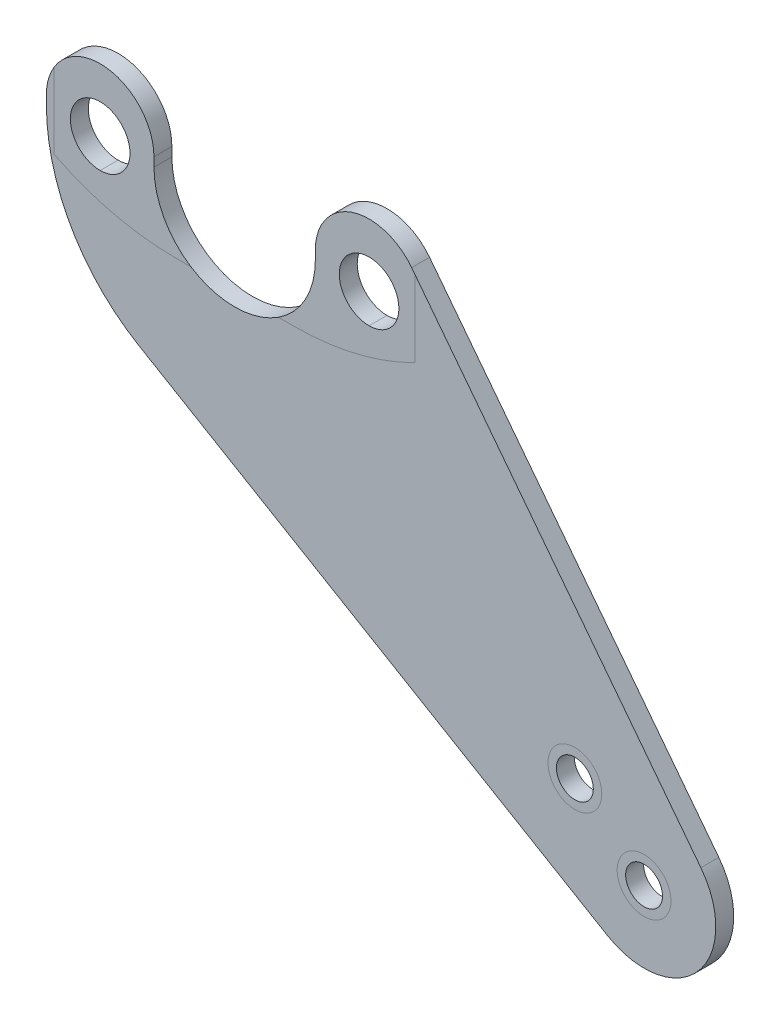
ISO-10303-21;
HEADER;
FILE_DESCRIPTION(('STEP AP214'),'2;1');
FILE_NAME('part.step','',(''),(''),'','','');
FILE_SCHEMA(('AUTOMOTIVE_DESIGN { 1 0 10303 214 1 1 1 1 }'));
ENDSEC;
DATA;
#1=APPLICATION_CONTEXT('core data for automotive mechanical design processes');
#2=APPLICATION_PROTOCOL_DEFINITION('international standard','automotive_design',2000,#1);
#3=PRODUCT_CONTEXT('',#1,'mechanical');
#4=PRODUCT('Part','Part','',(#3));
#5=PRODUCT_RELATED_PRODUCT_CATEGORY('part','',(#4));
#6=PRODUCT_DEFINITION_FORMATION('','',#4);
#7=PRODUCT_DEFINITION_CONTEXT('part definition',#1,'design');
#8=PRODUCT_DEFINITION('design','',#6,#7);
#9=PRODUCT_DEFINITION_SHAPE('','',#8);
#10=(LENGTH_UNIT() NAMED_UNIT(*) SI_UNIT(.MILLI.,.METRE.));
#11=(NAMED_UNIT(*) PLANE_ANGLE_UNIT() SI_UNIT($,.RADIAN.));
#12=(NAMED_UNIT(*) SI_UNIT($,.STERADIAN.) SOLID_ANGLE_UNIT());
#13=UNCERTAINTY_MEASURE_WITH_UNIT(LENGTH_MEASURE(1.E-05),#10,'distance_accuracy_value','');
#14=(GEOMETRIC_REPRESENTATION_CONTEXT(3) GLOBAL_UNCERTAINTY_ASSIGNED_CONTEXT((#13)) GLOBAL_UNIT_ASSIGNED_CONTEXT((#10,
#11,#12)) REPRESENTATION_CONTEXT('',''));
#15=CARTESIAN_POINT('',(0.,0.,0.));
#16=DIRECTION('',(0.,0.,1.));
#17=DIRECTION('',(1.,0.,0.));
#18=AXIS2_PLACEMENT_3D('',#15,#16,#17);
#19=CARTESIAN_POINT('',(-23.8125,0.,3.175));
#20=DIRECTION('',(0.,0.,-1.));
#21=DIRECTION('',(-1.,0.,0.));
#22=AXIS2_PLACEMENT_3D('',#19,#20,#21);
#23=CYLINDRICAL_SURFACE('',#22,5.27538461538462);
#24=CARTESIAN_POINT('',(-23.8125,0.,3.175));
#25=DIRECTION('',(0.,0.,1.));
#26=DIRECTION('',(1.,0.,0.));
#27=AXIS2_PLACEMENT_3D('',#24,#25,#26);
#28=CIRCLE('',#27,5.27538461538462);
#29=CARTESIAN_POINT('',(-23.8125,-5.27538461538462,3.175));
#30=VERTEX_POINT('',#29);
#31=CARTESIAN_POINT('',(-23.8125,5.27538461538462,3.175));
#32=VERTEX_POINT('',#31);
#33=EDGE_CURVE('E299',#30,#32,#28,.T.);
#34=ORIENTED_EDGE('',*,*,#33,.T.);
#35=DIRECTION('',(0.,0.,-1.));
#36=VECTOR('',#35,1.);
#37=CARTESIAN_POINT('',(-23.8125,5.27538461538462,3.175));
#38=LINE('',#37,#36);
#39=CARTESIAN_POINT('',(-23.8125,5.27538461538462,0.));
#40=VERTEX_POINT('',#39);
#41=EDGE_CURVE('E12',#32,#40,#38,.T.);
#42=ORIENTED_EDGE('',*,*,#41,.T.);
#43=CARTESIAN_POINT('',(-23.8125,0.,0.));
#44=DIRECTION('',(0.,0.,1.));
#45=DIRECTION('',(1.,0.,0.));
#46=AXIS2_PLACEMENT_3D('',#43,#44,#45);
#47=CIRCLE('',#46,5.27538461538462);
#48=CARTESIAN_POINT('',(-23.8125,-5.27538461538462,0.));
#49=VERTEX_POINT('',#48);
#50=EDGE_CURVE('E300',#49,#40,#47,.T.);
#51=ORIENTED_EDGE('',*,*,#50,.F.);
#52=DIRECTION('',(0.,0.,-1.));
#53=VECTOR('',#52,1.);
#54=CARTESIAN_POINT('',(-23.8125,-5.27538461538462,3.175));
#55=LINE('',#54,#53);
#56=EDGE_CURVE('E63',#49,#30,#55,.F.);
#57=ORIENTED_EDGE('',*,*,#56,.T.);
#58=EDGE_LOOP('',(#34,#42,#51,#57));
#59=FACE_BOUND('',#58,.T.);
#60=ADVANCED_FACE('F53',(#59),#23,.F.);
#61=CARTESIAN_POINT('',(23.8125,0.,3.175));
#62=DIRECTION('',(0.,0.,-1.));
#63=DIRECTION('',(-1.,0.,0.));
#64=AXIS2_PLACEMENT_3D('',#61,#62,#63);
#65=CYLINDRICAL_SURFACE('',#64,5.27538461538461);
#66=CARTESIAN_POINT('',(23.8125,0.,3.175));
#67=DIRECTION('',(0.,0.,1.));
#68=DIRECTION('',(1.,0.,0.));
#69=AXIS2_PLACEMENT_3D('',#66,#67,#68);
#70=CIRCLE('',#69,5.27538461538461);
#71=CARTESIAN_POINT('',(23.8125,-5.27538461538461,3.175));
#72=VERTEX_POINT('',#71);
#73=CARTESIAN_POINT('',(23.8125,5.27538461538461,3.175));
#74=VERTEX_POINT('',#73);
#75=EDGE_CURVE('E275',#72,#74,#70,.T.);
#76=ORIENTED_EDGE('',*,*,#75,.T.);
#77=DIRECTION('',(0.,0.,-1.));
#78=VECTOR('',#77,1.);
#79=CARTESIAN_POINT('',(23.8125,5.27538461538461,3.175));
#80=LINE('',#79,#78);
#81=CARTESIAN_POINT('',(23.8125,5.27538461538461,0.));
#82=VERTEX_POINT('',#81);
#83=EDGE_CURVE('E404',#74,#82,#80,.T.);
#84=ORIENTED_EDGE('',*,*,#83,.T.);
#85=CARTESIAN_POINT('',(23.8125,0.,0.));
#86=DIRECTION('',(0.,0.,1.));
#87=DIRECTION('',(1.,0.,0.));
#88=AXIS2_PLACEMENT_3D('',#85,#86,#87);
#89=CIRCLE('',#88,5.27538461538461);
#90=CARTESIAN_POINT('',(23.8125,-5.27538461538461,0.));
#91=VERTEX_POINT('',#90);
#92=EDGE_CURVE('E276',#91,#82,#89,.T.);
#93=ORIENTED_EDGE('',*,*,#92,.F.);
#94=DIRECTION('',(0.,0.,-1.));
#95=VECTOR('',#94,1.);
#96=CARTESIAN_POINT('',(23.8125,-5.27538461538461,3.175));
#97=LINE('',#96,#95);
#98=EDGE_CURVE('E399',#91,#72,#97,.F.);
#99=ORIENTED_EDGE('',*,*,#98,.T.);
#100=EDGE_LOOP('',(#76,#84,#93,#99));
#101=FACE_BOUND('',#100,.T.);
#102=ADVANCED_FACE('F740',(#101),#65,.F.);
#103=CARTESIAN_POINT('',(-23.8125,1.5875,3.175));
#104=DIRECTION('',(0.,0.,1.));
#105=DIRECTION('',(1.,0.,0.));
#106=AXIS2_PLACEMENT_3D('',#103,#104,#105);
#107=PLANE('',#106);
#108=CARTESIAN_POINT('',(60.2590233135367,-56.4872973548747,3.175));
#109=DIRECTION('',(0.,0.,1.));
#110=DIRECTION('',(1.,0.,0.));
#111=AXIS2_PLACEMENT_3D('',#108,#109,#110);
#112=CIRCLE('',#111,4.7625);
#113=CARTESIAN_POINT('',(65.0215233135367,-56.4872973548747,3.175));
#114=VERTEX_POINT('',#113);
#115=EDGE_CURVE('E387',#114,#114,#112,.F.);
#116=ORIENTED_EDGE('',*,*,#115,.T.);
#117=EDGE_LOOP('',(#116));
#118=FACE_BOUND('',#117,.T.);
#119=CARTESIAN_POINT('',(-10.5470919465067,35.1928122568759,3.175));
#120=DIRECTION('',(0.,0.,1.));
#121=DIRECTION('',(1.,0.,0.));
#122=AXIS2_PLACEMENT_3D('',#119,#120,#121);
#123=CIRCLE('',#122,47.1928122568759);
#124=CARTESIAN_POINT('',(-10.5470919465067,-12.,3.175));
#125=VERTEX_POINT('',#124);
#126=CARTESIAN_POINT('',(-31.95,-6.86758545363615,3.175));
#127=VERTEX_POINT('',#126);
#128=EDGE_CURVE('E378',#125,#127,#123,.F.);
#129=ORIENTED_EDGE('',*,*,#128,.T.);
#130=DIRECTION('',(0.,1.,0.));
#131=VECTOR('',#130,1.);
#132=CARTESIAN_POINT('',(-31.95,1.5875,3.175));
#133=LINE('',#132,#131);
#134=CARTESIAN_POINT('',(-31.95,6.53792611802258,3.175));
#135=VERTEX_POINT('',#134);
#136=EDGE_CURVE('E211',#127,#135,#133,.T.);
#137=ORIENTED_EDGE('',*,*,#136,.T.);
#138=CARTESIAN_POINT('',(-23.8125,1.5875,3.175));
#139=DIRECTION('',(0.,0.,1.));
#140=DIRECTION('',(1.,0.,0.));
#141=AXIS2_PLACEMENT_3D('',#138,#139,#140);
#142=CIRCLE('',#141,9.525);
#143=CARTESIAN_POINT('',(-33.3375,1.5875,3.175));
#144=VERTEX_POINT('',#143);
#145=EDGE_CURVE('E204',#135,#144,#142,.T.);
#146=ORIENTED_EDGE('',*,*,#145,.T.);
#147=DIRECTION('',(0.,-1.,0.));
#148=VECTOR('',#147,1.);
#149=CARTESIAN_POINT('',(-33.3375,1.5875,3.175));
#150=LINE('',#149,#148);
#151=CARTESIAN_POINT('',(-33.3375,0.,3.175));
#152=VERTEX_POINT('',#151);
#153=EDGE_CURVE('E209',#144,#152,#150,.T.);
#154=ORIENTED_EDGE('',*,*,#153,.T.);
#155=CARTESIAN_POINT('',(0.,0.,3.175));
#156=DIRECTION('',(0.,0.,1.));
#157=DIRECTION('',(1.,0.,0.));
#158=AXIS2_PLACEMENT_3D('',#155,#156,#157);
#159=CIRCLE('',#158,33.3375);
#160=CARTESIAN_POINT('',(-16.9470538991239,-28.7086445237351,3.175));
#161=VERTEX_POINT('',#160);
#162=EDGE_CURVE('E229',#152,#161,#159,.T.);
#163=ORIENTED_EDGE('',*,*,#162,.T.);
#164=DIRECTION('',(0.861151691750585,-0.508348073464535,0.));
#165=VECTOR('',#164,1.);
#166=CARTESIAN_POINT('',(-16.9470538991239,-28.7086445237351,3.175));
#167=LINE('',#166,#165);
#168=CARTESIAN_POINT('',(66.0597138704407,-77.7085255950918,3.175));
#169=VERTEX_POINT('',#168);
#170=EDGE_CURVE('E456',#161,#169,#167,.T.);
#171=ORIENTED_EDGE('',*,*,#170,.T.);
#172=CARTESIAN_POINT('',(72.5157344034403,-66.7718991098594,3.175));
#173=DIRECTION('',(0.,0.,1.));
#174=DIRECTION('',(1.,0.,0.));
#175=AXIS2_PLACEMENT_3D('',#172,#173,#174);
#176=CIRCLE('',#175,12.7);
#177=CARTESIAN_POINT('',(82.5729226450536,-59.0167095781487,3.175));
#178=VERTEX_POINT('',#177);
#179=EDGE_CURVE('E469',#169,#178,#176,.T.);
#180=ORIENTED_EDGE('',*,*,#179,.T.);
#181=DIRECTION('',(-0.610644845016591,0.791904585953802,0.));
#182=VECTOR('',#181,1.);
#183=CARTESIAN_POINT('',(31.35539118121,7.40389214878303,3.175));
#184=LINE('',#183,#182);
#185=CARTESIAN_POINT('',(31.95,6.63278361607183,3.175));
#186=VERTEX_POINT('',#185);
#187=EDGE_CURVE('E473',#178,#186,#184,.T.);
#188=ORIENTED_EDGE('',*,*,#187,.T.);
#189=DIRECTION('',(0.,-1.,0.));
#190=VECTOR('',#189,1.);
#191=CARTESIAN_POINT('',(31.95,1.58749999999997,3.175));
#192=LINE('',#191,#190);
#193=CARTESIAN_POINT('',(31.95,-6.86758545363616,3.175));
#194=VERTEX_POINT('',#193);
#195=EDGE_CURVE('E365',#186,#194,#192,.T.);
#196=ORIENTED_EDGE('',*,*,#195,.T.);
#197=CARTESIAN_POINT('',(10.5470919465067,35.1928122568759,3.175));
#198=DIRECTION('',(0.,0.,1.));
#199=DIRECTION('',(1.,0.,0.));
#200=AXIS2_PLACEMENT_3D('',#197,#198,#199);
#201=CIRCLE('',#200,47.1928122568759);
#202=CARTESIAN_POINT('',(10.5470919465067,-12.,3.175));
#203=VERTEX_POINT('',#202);
#204=EDGE_CURVE('E370',#194,#203,#201,.F.);
#205=ORIENTED_EDGE('',*,*,#204,.T.);
#206=DIRECTION('',(-1.,0.,0.));
#207=VECTOR('',#206,1.);
#208=CARTESIAN_POINT('',(-23.8125,-12.,3.175));
#209=LINE('',#208,#207);
#210=CARTESIAN_POINT('',(7.75452488873432,-12.,3.175));
#211=VERTEX_POINT('',#210);
#212=EDGE_CURVE('E373',#203,#211,#209,.T.);
#213=ORIENTED_EDGE('',*,*,#212,.T.);
#214=CARTESIAN_POINT('',(0.,0.,3.175));
#215=DIRECTION('',(0.,0.,-1.));
#216=DIRECTION('',(1.,0.,0.));
#217=AXIS2_PLACEMENT_3D('',#214,#215,#216);
#218=CIRCLE('',#217,14.2875);
#219=CARTESIAN_POINT('',(-7.75452488873432,-12.,3.175));
#220=VERTEX_POINT('',#219);
#221=EDGE_CURVE('E494',#211,#220,#218,.T.);
#222=ORIENTED_EDGE('',*,*,#221,.T.);
#223=EDGE_CURVE('E377',#220,#125,#209,.T.);
#224=ORIENTED_EDGE('',*,*,#223,.T.);
#225=EDGE_LOOP('',(#129,#137,#146,#154,#163,#171,#180,#188,#196,#205,#213,#222,#224));
#226=FACE_BOUND('',#225,.T.);
#227=CARTESIAN_POINT('',(72.5157344034403,-66.7718991098594,3.175));
#228=DIRECTION('',(0.,0.,1.));
#229=DIRECTION('',(1.,0.,0.));
#230=AXIS2_PLACEMENT_3D('',#227,#228,#229);
#231=CIRCLE('',#230,4.7625);
#232=CARTESIAN_POINT('',(77.2782344034403,-66.7718991098594,3.175));
#233=VERTEX_POINT('',#232);
#234=EDGE_CURVE('E395',#233,#233,#231,.F.);
#235=ORIENTED_EDGE('',*,*,#234,.T.);
#236=EDGE_LOOP('',(#235));
#237=FACE_BOUND('',#236,.T.);
#238=ADVANCED_FACE('F207',(#118,#226,#237),#107,.T.);
#239=CARTESIAN_POINT('',(-23.8125,1.5875,0.));
#240=DIRECTION('',(0.,0.,1.));
#241=DIRECTION('',(1.,0.,0.));
#242=AXIS2_PLACEMENT_3D('',#239,#240,#241);
#243=PLANE('',#242);
#244=CARTESIAN_POINT('',(60.2590233135367,-56.4872973548747,0.));
#245=DIRECTION('',(0.,0.,1.));
#246=DIRECTION('',(1.,0.,0.));
#247=AXIS2_PLACEMENT_3D('',#244,#245,#246);
#248=CIRCLE('',#247,4.7625);
#249=CARTESIAN_POINT('',(65.0215233135367,-56.4872973548747,0.));
#250=VERTEX_POINT('',#249);
#251=EDGE_CURVE('E386',#250,#250,#248,.F.);
#252=ORIENTED_EDGE('',*,*,#251,.F.);
#253=EDGE_LOOP('',(#252));
#254=FACE_BOUND('',#253,.T.);
#255=CARTESIAN_POINT('',(0.,0.,0.));
#256=DIRECTION('',(0.,0.,1.));
#257=DIRECTION('',(1.,0.,0.));
#258=AXIS2_PLACEMENT_3D('',#255,#256,#257);
#259=CIRCLE('',#258,33.3375);
#260=CARTESIAN_POINT('',(-32.2911485861995,-8.28677435640597,0.));
#261=VERTEX_POINT('',#260);
#262=CARTESIAN_POINT('',(-16.9470538991239,-28.7086445237351,0.));
#263=VERTEX_POINT('',#262);
#264=EDGE_CURVE('E336',#261,#263,#259,.T.);
#265=ORIENTED_EDGE('',*,*,#264,.F.);
#266=CARTESIAN_POINT('',(-26.9875,-2.38125,0.));
#267=DIRECTION('',(0.,0.,1.));
#268=DIRECTION('',(1.,0.,0.));
#269=AXIS2_PLACEMENT_3D('',#266,#267,#268);
#270=CIRCLE('',#269,7.9375);
#271=CARTESIAN_POINT('',(-31.75,-8.73125,0.));
#272=VERTEX_POINT('',#271);
#273=EDGE_CURVE('E351',#261,#272,#270,.T.);
#274=ORIENTED_EDGE('',*,*,#273,.T.);
#275=DIRECTION('',(0.8,-0.6,0.));
#276=VECTOR('',#275,1.);
#277=CARTESIAN_POINT('',(-31.623,-8.8265,0.));
#278=LINE('',#277,#276);
#279=CARTESIAN_POINT('',(-24.3416666666667,-14.2875,0.));
#280=VERTEX_POINT('',#279);
#281=EDGE_CURVE('E346',#272,#280,#278,.T.);
#282=ORIENTED_EDGE('',*,*,#281,.T.);
#283=CARTESIAN_POINT('',(-19.5791666666667,-7.9375,0.));
#284=DIRECTION('',(0.,0.,1.));
#285=DIRECTION('',(1.,0.,0.));
#286=AXIS2_PLACEMENT_3D('',#283,#284,#285);
#287=CIRCLE('',#286,7.9375);
#288=CARTESIAN_POINT('',(-19.5791666666667,-15.875,0.));
#289=VERTEX_POINT('',#288);
#290=EDGE_CURVE('E352',#280,#289,#287,.T.);
#291=ORIENTED_EDGE('',*,*,#290,.T.);
#292=DIRECTION('',(1.,0.,0.));
#293=VECTOR('',#292,1.);
#294=CARTESIAN_POINT('',(-23.8125,-15.875,0.));
#295=LINE('',#294,#293);
#296=CARTESIAN_POINT('',(19.5791666666667,-15.875,0.));
#297=VERTEX_POINT('',#296);
#298=EDGE_CURVE('E652',#289,#297,#295,.T.);
#299=ORIENTED_EDGE('',*,*,#298,.T.);
#300=CARTESIAN_POINT('',(19.5791666666667,-7.9375,0.));
#301=DIRECTION('',(0.,0.,1.));
#302=DIRECTION('',(1.,0.,0.));
#303=AXIS2_PLACEMENT_3D('',#300,#301,#302);
#304=CIRCLE('',#303,7.9375);
#305=CARTESIAN_POINT('',(24.3416666666667,-14.2875,0.));
#306=VERTEX_POINT('',#305);
#307=EDGE_CURVE('E648',#297,#306,#304,.T.);
#308=ORIENTED_EDGE('',*,*,#307,.T.);
#309=DIRECTION('',(0.8,0.6,0.));
#310=VECTOR('',#309,1.);
#311=CARTESIAN_POINT('',(1.14300000000001,-31.6865,0.));
#312=LINE('',#311,#310);
#313=CARTESIAN_POINT('',(31.75,-8.73125,0.));
#314=VERTEX_POINT('',#313);
#315=EDGE_CURVE('E258',#306,#314,#312,.T.);
#316=ORIENTED_EDGE('',*,*,#315,.T.);
#317=CARTESIAN_POINT('',(26.9875,-2.38125,0.));
#318=DIRECTION('',(0.,0.,1.));
#319=DIRECTION('',(1.,0.,0.));
#320=AXIS2_PLACEMENT_3D('',#317,#318,#319);
#321=CIRCLE('',#320,7.9375);
#322=CARTESIAN_POINT('',(34.925,-2.38125,0.));
#323=VERTEX_POINT('',#322);
#324=EDGE_CURVE('E239',#314,#323,#321,.T.);
#325=ORIENTED_EDGE('',*,*,#324,.T.);
#326=DIRECTION('',(0.,1.,0.));
#327=VECTOR('',#326,1.);
#328=CARTESIAN_POINT('',(34.925,1.58750000000001,0.));
#329=LINE('',#328,#327);
#330=CARTESIAN_POINT('',(34.925,2.77470446836601,0.));
#331=VERTEX_POINT('',#330);
#332=EDGE_CURVE('E235',#323,#331,#329,.T.);
#333=ORIENTED_EDGE('',*,*,#332,.T.);
#334=DIRECTION('',(-0.610644845016591,0.791904585953802,0.));
#335=VECTOR('',#334,1.);
#336=CARTESIAN_POINT('',(31.35539118121,7.40389214878303,0.));
#337=LINE('',#336,#335);
#338=CARTESIAN_POINT('',(82.5729226450536,-59.0167095781487,0.));
#339=VERTEX_POINT('',#338);
#340=EDGE_CURVE('E570',#339,#331,#337,.T.);
#341=ORIENTED_EDGE('',*,*,#340,.F.);
#342=CARTESIAN_POINT('',(72.5157344034403,-66.7718991098594,0.));
#343=DIRECTION('',(0.,0.,1.));
#344=DIRECTION('',(1.,0.,0.));
#345=AXIS2_PLACEMENT_3D('',#342,#343,#344);
#346=CIRCLE('',#345,12.7);
#347=CARTESIAN_POINT('',(66.0597138704407,-77.7085255950918,0.));
#348=VERTEX_POINT('',#347);
#349=EDGE_CURVE('E563',#348,#339,#346,.T.);
#350=ORIENTED_EDGE('',*,*,#349,.F.);
#351=DIRECTION('',(0.861151691750585,-0.508348073464535,0.));
#352=VECTOR('',#351,1.);
#353=CARTESIAN_POINT('',(-16.9470538991239,-28.7086445237351,0.));
#354=LINE('',#353,#352);
#355=EDGE_CURVE('E335',#263,#348,#354,.T.);
#356=ORIENTED_EDGE('',*,*,#355,.F.);
#357=EDGE_LOOP('',(#265,#274,#282,#291,#299,#308,#316,#325,#333,#341,#350,#356));
#358=FACE_BOUND('',#357,.T.);
#359=CARTESIAN_POINT('',(72.5157344034403,-66.7718991098594,0.));
#360=DIRECTION('',(0.,0.,1.));
#361=DIRECTION('',(1.,0.,0.));
#362=AXIS2_PLACEMENT_3D('',#359,#360,#361);
#363=CIRCLE('',#362,4.7625);
#364=CARTESIAN_POINT('',(77.2782344034403,-66.7718991098594,0.));
#365=VERTEX_POINT('',#364);
#366=EDGE_CURVE('E391',#365,#365,#363,.F.);
#367=ORIENTED_EDGE('',*,*,#366,.F.);
#368=EDGE_LOOP('',(#367));
#369=FACE_BOUND('',#368,.T.);
#370=ADVANCED_FACE('F560',(#254,#358,#369),#243,.F.);
#371=ORIENTED_EDGE('',*,*,#234,.F.);
#372=EDGE_LOOP('',(#371));
#373=FACE_BOUND('',#372,.T.);
#374=CARTESIAN_POINT('',(72.5157344034403,-66.7718991098594,3.175));
#375=DIRECTION('',(0.,0.,1.));
#376=DIRECTION('',(1.,0.,0.));
#377=AXIS2_PLACEMENT_3D('',#374,#375,#376);
#378=CIRCLE('',#377,3.26389999999998);
#379=CARTESIAN_POINT('',(75.7796344034403,-66.7718991098594,3.175));
#380=VERTEX_POINT('',#379);
#381=EDGE_CURVE('E425',#380,#380,#378,.T.);
#382=ORIENTED_EDGE('',*,*,#381,.F.);
#383=EDGE_LOOP('',(#382));
#384=FACE_BOUND('',#383,.T.);
#385=ADVANCED_FACE('F771',(#373,#384),#107,.T.);
#386=ORIENTED_EDGE('',*,*,#366,.T.);
#387=EDGE_LOOP('',(#386));
#388=FACE_BOUND('',#387,.T.);
#389=CARTESIAN_POINT('',(72.5157344034403,-66.7718991098594,0.));
#390=DIRECTION('',(0.,0.,1.));
#391=DIRECTION('',(1.,0.,0.));
#392=AXIS2_PLACEMENT_3D('',#389,#390,#391);
#393=CIRCLE('',#392,3.26389999999998);
#394=CARTESIAN_POINT('',(75.7796344034403,-66.7718991098594,0.));
#395=VERTEX_POINT('',#394);
#396=EDGE_CURVE('E428',#395,#395,#393,.T.);
#397=ORIENTED_EDGE('',*,*,#396,.T.);
#398=EDGE_LOOP('',(#397));
#399=FACE_BOUND('',#398,.T.);
#400=ADVANCED_FACE('F768',(#388,#399),#243,.F.);
#401=ORIENTED_EDGE('',*,*,#115,.F.);
#402=EDGE_LOOP('',(#401));
#403=FACE_BOUND('',#402,.T.);
#404=CARTESIAN_POINT('',(60.2590233135367,-56.4872973548747,3.175));
#405=DIRECTION('',(0.,0.,1.));
#406=DIRECTION('',(1.,0.,0.));
#407=AXIS2_PLACEMENT_3D('',#404,#405,#406);
#408=CIRCLE('',#407,3.26389999999998);
#409=CARTESIAN_POINT('',(63.5229233135367,-56.4872973548747,3.175));
#410=VERTEX_POINT('',#409);
#411=EDGE_CURVE('E431',#410,#410,#408,.T.);
#412=ORIENTED_EDGE('',*,*,#411,.F.);
#413=EDGE_LOOP('',(#412));
#414=FACE_BOUND('',#413,.T.);
#415=ADVANCED_FACE('F772',(#403,#414),#107,.T.);
#416=ORIENTED_EDGE('',*,*,#136,.F.);
#417=ORIENTED_EDGE('',*,*,#128,.F.);
#418=ORIENTED_EDGE('',*,*,#223,.F.);
#419=CARTESIAN_POINT('',(-14.2875,0.,3.175));
#420=VERTEX_POINT('',#419);
#421=EDGE_CURVE('E489',#220,#420,#218,.T.);
#422=ORIENTED_EDGE('',*,*,#421,.T.);
#423=DIRECTION('',(0.,1.,0.));
#424=VECTOR('',#423,1.);
#425=CARTESIAN_POINT('',(-14.2875,1.5875,3.175));
#426=LINE('',#425,#424);
#427=CARTESIAN_POINT('',(-14.2875,1.5875,3.175));
#428=VERTEX_POINT('',#427);
#429=EDGE_CURVE('E319',#420,#428,#426,.T.);
#430=ORIENTED_EDGE('',*,*,#429,.T.);
#431=EDGE_CURVE('E217',#428,#135,#142,.T.);
#432=ORIENTED_EDGE('',*,*,#431,.T.);
#433=EDGE_LOOP('',(#416,#417,#418,#422,#430,#432));
#434=FACE_BOUND('',#433,.T.);
#435=EDGE_CURVE('E280',#32,#30,#28,.T.);
#436=ORIENTED_EDGE('',*,*,#435,.F.);
#437=ORIENTED_EDGE('',*,*,#33,.F.);
#438=EDGE_LOOP('',(#436,#437));
#439=FACE_BOUND('',#438,.T.);
#440=ADVANCED_FACE('F412',(#434,#439),#107,.T.);
#441=EDGE_CURVE('E270',#82,#91,#89,.T.);
#442=ORIENTED_EDGE('',*,*,#441,.T.);
#443=ORIENTED_EDGE('',*,*,#92,.T.);
#444=EDGE_LOOP('',(#442,#443));
#445=FACE_BOUND('',#444,.T.);
#446=EDGE_CURVE('E295',#40,#49,#47,.T.);
#447=ORIENTED_EDGE('',*,*,#446,.T.);
#448=ORIENTED_EDGE('',*,*,#50,.T.);
#449=EDGE_LOOP('',(#447,#448));
#450=FACE_BOUND('',#449,.T.);
#451=ORIENTED_EDGE('',*,*,#273,.F.);
#452=CARTESIAN_POINT('',(-33.3375,0.,0.));
#453=VERTEX_POINT('',#452);
#454=EDGE_CURVE('E331',#453,#261,#259,.T.);
#455=ORIENTED_EDGE('',*,*,#454,.F.);
#456=DIRECTION('',(0.,-1.,0.));
#457=VECTOR('',#456,1.);
#458=CARTESIAN_POINT('',(-33.3375,1.5875,0.));
#459=LINE('',#458,#457);
#460=CARTESIAN_POINT('',(-33.3375,1.5875,0.));
#461=VERTEX_POINT('',#460);
#462=EDGE_CURVE('E318',#461,#453,#459,.T.);
#463=ORIENTED_EDGE('',*,*,#462,.F.);
#464=CARTESIAN_POINT('',(-23.8125,1.5875,0.));
#465=DIRECTION('',(0.,0.,1.));
#466=DIRECTION('',(1.,0.,0.));
#467=AXIS2_PLACEMENT_3D('',#464,#465,#466);
#468=CIRCLE('',#467,9.525);
#469=CARTESIAN_POINT('',(-14.2875,1.5875,0.));
#470=VERTEX_POINT('',#469);
#471=EDGE_CURVE('E233',#470,#461,#468,.T.);
#472=ORIENTED_EDGE('',*,*,#471,.F.);
#473=DIRECTION('',(0.,1.,0.));
#474=VECTOR('',#473,1.);
#475=CARTESIAN_POINT('',(-14.2875,1.5875,0.));
#476=LINE('',#475,#474);
#477=CARTESIAN_POINT('',(-14.2875,0.,0.));
#478=VERTEX_POINT('',#477);
#479=EDGE_CURVE('E218',#478,#470,#476,.T.);
#480=ORIENTED_EDGE('',*,*,#479,.F.);
#481=CARTESIAN_POINT('',(0.,0.,0.));
#482=DIRECTION('',(0.,0.,-1.));
#483=DIRECTION('',(1.,0.,0.));
#484=AXIS2_PLACEMENT_3D('',#481,#482,#483);
#485=CIRCLE('',#484,14.2875);
#486=CARTESIAN_POINT('',(14.2875,0.,0.));
#487=VERTEX_POINT('',#486);
#488=EDGE_CURVE('E587',#487,#478,#485,.T.);
#489=ORIENTED_EDGE('',*,*,#488,.F.);
#490=DIRECTION('',(0.,-1.,0.));
#491=VECTOR('',#490,1.);
#492=CARTESIAN_POINT('',(14.2875,0.,0.));
#493=LINE('',#492,#491);
#494=CARTESIAN_POINT('',(14.2875,1.5875,0.));
#495=VERTEX_POINT('',#494);
#496=EDGE_CURVE('E584',#495,#487,#493,.T.);
#497=ORIENTED_EDGE('',*,*,#496,.F.);
#498=CARTESIAN_POINT('',(23.8125,1.5875,0.));
#499=DIRECTION('',(0.,0.,1.));
#500=DIRECTION('',(1.,0.,0.));
#501=AXIS2_PLACEMENT_3D('',#498,#499,#500);
#502=CIRCLE('',#501,9.525);
#503=CARTESIAN_POINT('',(31.35539118121,7.40389214878303,0.));
#504=VERTEX_POINT('',#503);
#505=EDGE_CURVE('E581',#504,#495,#502,.T.);
#506=ORIENTED_EDGE('',*,*,#505,.F.);
#507=EDGE_CURVE('E566',#331,#504,#337,.T.);
#508=ORIENTED_EDGE('',*,*,#507,.F.);
#509=ORIENTED_EDGE('',*,*,#332,.F.);
#510=ORIENTED_EDGE('',*,*,#324,.F.);
#511=ORIENTED_EDGE('',*,*,#315,.F.);
#512=ORIENTED_EDGE('',*,*,#307,.F.);
#513=ORIENTED_EDGE('',*,*,#298,.F.);
#514=ORIENTED_EDGE('',*,*,#290,.F.);
#515=ORIENTED_EDGE('',*,*,#281,.F.);
#516=EDGE_LOOP('',(#451,#455,#463,#472,#480,#489,#497,#506,#508,#509,#510,#511,#512,#513,#514,#515));
#517=FACE_BOUND('',#516,.T.);
#518=ADVANCED_FACE('F603',(#445,#450,#517),#243,.F.);
#519=ORIENTED_EDGE('',*,*,#212,.F.);
#520=ORIENTED_EDGE('',*,*,#204,.F.);
#521=ORIENTED_EDGE('',*,*,#195,.F.);
#522=CARTESIAN_POINT('',(31.35539118121,7.40389214878303,3.175));
#523=VERTEX_POINT('',#522);
#524=EDGE_CURVE('E472',#186,#523,#184,.T.);
#525=ORIENTED_EDGE('',*,*,#524,.T.);
#526=CARTESIAN_POINT('',(23.8125,1.5875,3.175));
#527=DIRECTION('',(0.,0.,1.));
#528=DIRECTION('',(1.,0.,0.));
#529=AXIS2_PLACEMENT_3D('',#526,#527,#528);
#530=CIRCLE('',#529,9.525);
#531=CARTESIAN_POINT('',(14.2875,1.5875,3.175));
#532=VERTEX_POINT('',#531);
#533=EDGE_CURVE('E478',#523,#532,#530,.T.);
#534=ORIENTED_EDGE('',*,*,#533,.T.);
#535=DIRECTION('',(0.,-1.,0.));
#536=VECTOR('',#535,1.);
#537=CARTESIAN_POINT('',(14.2875,0.,3.175));
#538=LINE('',#537,#536);
#539=CARTESIAN_POINT('',(14.2875,0.,3.175));
#540=VERTEX_POINT('',#539);
#541=EDGE_CURVE('E486',#532,#540,#538,.T.);
#542=ORIENTED_EDGE('',*,*,#541,.T.);
#543=EDGE_CURVE('E490',#540,#211,#218,.T.);
#544=ORIENTED_EDGE('',*,*,#543,.T.);
#545=EDGE_LOOP('',(#519,#520,#521,#525,#534,#542,#544));
#546=FACE_BOUND('',#545,.T.);
#547=EDGE_CURVE('E277',#74,#72,#70,.T.);
#548=ORIENTED_EDGE('',*,*,#547,.F.);
#549=ORIENTED_EDGE('',*,*,#75,.F.);
#550=EDGE_LOOP('',(#548,#549));
#551=FACE_BOUND('',#550,.T.);
#552=ADVANCED_FACE('F617',(#546,#551),#107,.T.);
#553=ORIENTED_EDGE('',*,*,#251,.T.);
#554=EDGE_LOOP('',(#553));
#555=FACE_BOUND('',#554,.T.);
#556=CARTESIAN_POINT('',(60.2590233135367,-56.4872973548747,0.));
#557=DIRECTION('',(0.,0.,1.));
#558=DIRECTION('',(1.,0.,0.));
#559=AXIS2_PLACEMENT_3D('',#556,#557,#558);
#560=CIRCLE('',#559,3.26389999999998);
#561=CARTESIAN_POINT('',(63.5229233135367,-56.4872973548747,0.));
#562=VERTEX_POINT('',#561);
#563=EDGE_CURVE('E434',#562,#562,#560,.T.);
#564=ORIENTED_EDGE('',*,*,#563,.T.);
#565=EDGE_LOOP('',(#564));
#566=FACE_BOUND('',#565,.T.);
#567=ADVANCED_FACE('F762',(#555,#566),#243,.F.);
#568=CARTESIAN_POINT('',(-23.8125,1.5875,3.175));
#569=DIRECTION('',(0.,0.,-1.));
#570=DIRECTION('',(-1.,0.,0.));
#571=AXIS2_PLACEMENT_3D('',#568,#569,#570);
#572=CYLINDRICAL_SURFACE('',#571,9.525);
#573=ORIENTED_EDGE('',*,*,#471,.T.);
#574=DIRECTION('',(0.,0.,-1.));
#575=VECTOR('',#574,1.);
#576=CARTESIAN_POINT('',(-33.3375,1.5875,3.175));
#577=LINE('',#576,#575);
#578=EDGE_CURVE('E223',#144,#461,#577,.T.);
#579=ORIENTED_EDGE('',*,*,#578,.F.);
#580=ORIENTED_EDGE('',*,*,#145,.F.);
#581=ORIENTED_EDGE('',*,*,#431,.F.);
#582=DIRECTION('',(0.,0.,-1.));
#583=VECTOR('',#582,1.);
#584=CARTESIAN_POINT('',(-14.2875,1.5875,3.175));
#585=LINE('',#584,#583);
#586=EDGE_CURVE('E510',#428,#470,#585,.T.);
#587=ORIENTED_EDGE('',*,*,#586,.T.);
#588=EDGE_LOOP('',(#573,#579,#580,#581,#587));
#589=FACE_BOUND('',#588,.T.);
#590=ADVANCED_FACE('F55',(#589),#572,.T.);
#591=CARTESIAN_POINT('',(-33.3375,1.5875,3.175));
#592=DIRECTION('',(1.,0.,0.));
#593=DIRECTION('',(0.,0.,-1.));
#594=AXIS2_PLACEMENT_3D('',#591,#592,#593);
#595=PLANE('',#594);
#596=ORIENTED_EDGE('',*,*,#462,.T.);
#597=DIRECTION('',(0.,0.,-1.));
#598=VECTOR('',#597,1.);
#599=CARTESIAN_POINT('',(-33.3375,0.,3.175));
#600=LINE('',#599,#598);
#601=EDGE_CURVE('E226',#152,#453,#600,.T.);
#602=ORIENTED_EDGE('',*,*,#601,.F.);
#603=ORIENTED_EDGE('',*,*,#153,.F.);
#604=ORIENTED_EDGE('',*,*,#578,.T.);
#605=EDGE_LOOP('',(#596,#602,#603,#604));
#606=FACE_BOUND('',#605,.T.);
#607=ADVANCED_FACE('F222',(#606),#595,.F.);
#608=CARTESIAN_POINT('',(0.,0.,3.175));
#609=DIRECTION('',(0.,0.,-1.));
#610=DIRECTION('',(-1.,0.,0.));
#611=AXIS2_PLACEMENT_3D('',#608,#609,#610);
#612=CYLINDRICAL_SURFACE('',#611,33.3375);
#613=ORIENTED_EDGE('',*,*,#454,.T.);
#614=ORIENTED_EDGE('',*,*,#264,.T.);
#615=DIRECTION('',(0.,0.,-1.));
#616=VECTOR('',#615,1.);
#617=CARTESIAN_POINT('',(-16.9470538991239,-28.7086445237351,3.175));
#618=LINE('',#617,#616);
#619=EDGE_CURVE('E241',#161,#263,#618,.T.);
#620=ORIENTED_EDGE('',*,*,#619,.F.);
#621=ORIENTED_EDGE('',*,*,#162,.F.);
#622=ORIENTED_EDGE('',*,*,#601,.T.);
#623=EDGE_LOOP('',(#613,#614,#620,#621,#622));
#624=FACE_BOUND('',#623,.T.);
#625=ADVANCED_FACE('F606',(#624),#612,.T.);
#626=CARTESIAN_POINT('',(-16.9470538991239,-28.7086445237351,3.175));
#627=DIRECTION('',(0.508348073464535,0.861151691750585,0.));
#628=DIRECTION('',(-0.861151691750585,0.508348073464535,0.));
#629=AXIS2_PLACEMENT_3D('',#626,#627,#628);
#630=PLANE('',#629);
#631=ORIENTED_EDGE('',*,*,#355,.T.);
#632=DIRECTION('',(0.,0.,-1.));
#633=VECTOR('',#632,1.);
#634=CARTESIAN_POINT('',(66.0597138704407,-77.7085255950918,3.175));
#635=LINE('',#634,#633);
#636=EDGE_CURVE('E543',#169,#348,#635,.T.);
#637=ORIENTED_EDGE('',*,*,#636,.F.);
#638=ORIENTED_EDGE('',*,*,#170,.F.);
#639=ORIENTED_EDGE('',*,*,#619,.T.);
#640=EDGE_LOOP('',(#631,#637,#638,#639));
#641=FACE_BOUND('',#640,.T.);
#642=ADVANCED_FACE('F554',(#641),#630,.F.);
#643=CARTESIAN_POINT('',(72.5157344034403,-66.7718991098594,3.175));
#644=DIRECTION('',(0.,0.,-1.));
#645=DIRECTION('',(-1.,0.,0.));
#646=AXIS2_PLACEMENT_3D('',#643,#644,#645);
#647=CYLINDRICAL_SURFACE('',#646,12.7);
#648=ORIENTED_EDGE('',*,*,#349,.T.);
#649=DIRECTION('',(0.,0.,-1.));
#650=VECTOR('',#649,1.);
#651=CARTESIAN_POINT('',(82.5729226450536,-59.0167095781487,3.175));
#652=LINE('',#651,#650);
#653=EDGE_CURVE('E538',#178,#339,#652,.T.);
#654=ORIENTED_EDGE('',*,*,#653,.F.);
#655=ORIENTED_EDGE('',*,*,#179,.F.);
#656=ORIENTED_EDGE('',*,*,#636,.T.);
#657=EDGE_LOOP('',(#648,#654,#655,#656));
#658=FACE_BOUND('',#657,.T.);
#659=ADVANCED_FACE('F609',(#658),#647,.T.);
#660=CARTESIAN_POINT('',(31.35539118121,7.40389214878303,3.175));
#661=DIRECTION('',(-0.791904585953802,-0.610644845016591,0.));
#662=DIRECTION('',(0.610644845016591,-0.791904585953802,0.));
#663=AXIS2_PLACEMENT_3D('',#660,#661,#662);
#664=PLANE('',#663);
#665=ORIENTED_EDGE('',*,*,#340,.T.);
#666=ORIENTED_EDGE('',*,*,#507,.T.);
#667=DIRECTION('',(0.,0.,-1.));
#668=VECTOR('',#667,1.);
#669=CARTESIAN_POINT('',(31.35539118121,7.40389214878303,3.175));
#670=LINE('',#669,#668);
#671=EDGE_CURVE('E534',#523,#504,#670,.T.);
#672=ORIENTED_EDGE('',*,*,#671,.F.);
#673=ORIENTED_EDGE('',*,*,#524,.F.);
#674=ORIENTED_EDGE('',*,*,#187,.F.);
#675=ORIENTED_EDGE('',*,*,#653,.T.);
#676=EDGE_LOOP('',(#665,#666,#672,#673,#674,#675));
#677=FACE_BOUND('',#676,.T.);
#678=ADVANCED_FACE('F614',(#677),#664,.F.);
#679=CARTESIAN_POINT('',(23.8125,1.5875,3.175));
#680=DIRECTION('',(0.,0.,-1.));
#681=DIRECTION('',(-1.,0.,0.));
#682=AXIS2_PLACEMENT_3D('',#679,#680,#681);
#683=CYLINDRICAL_SURFACE('',#682,9.525);
#684=ORIENTED_EDGE('',*,*,#505,.T.);
#685=DIRECTION('',(0.,0.,-1.));
#686=VECTOR('',#685,1.);
#687=CARTESIAN_POINT('',(14.2875,1.5875,3.175));
#688=LINE('',#687,#686);
#689=EDGE_CURVE('E526',#532,#495,#688,.T.);
#690=ORIENTED_EDGE('',*,*,#689,.F.);
#691=ORIENTED_EDGE('',*,*,#533,.F.);
#692=ORIENTED_EDGE('',*,*,#671,.T.);
#693=EDGE_LOOP('',(#684,#690,#691,#692));
#694=FACE_BOUND('',#693,.T.);
#695=ADVANCED_FACE('F642',(#694),#683,.T.);
#696=CARTESIAN_POINT('',(14.2875,0.,3.175));
#697=DIRECTION('',(1.,0.,0.));
#698=DIRECTION('',(0.,0.,-1.));
#699=AXIS2_PLACEMENT_3D('',#696,#697,#698);
#700=PLANE('',#699);
#701=ORIENTED_EDGE('',*,*,#496,.T.);
#702=DIRECTION('',(0.,0.,-1.));
#703=VECTOR('',#702,1.);
#704=CARTESIAN_POINT('',(14.2875,0.,3.175));
#705=LINE('',#704,#703);
#706=EDGE_CURVE('E521',#540,#487,#705,.T.);
#707=ORIENTED_EDGE('',*,*,#706,.F.);
#708=ORIENTED_EDGE('',*,*,#541,.F.);
#709=ORIENTED_EDGE('',*,*,#689,.T.);
#710=EDGE_LOOP('',(#701,#707,#708,#709));
#711=FACE_BOUND('',#710,.T.);
#712=ADVANCED_FACE('F635',(#711),#700,.F.);
#713=CARTESIAN_POINT('',(0.,0.,3.175));
#714=DIRECTION('',(0.,0.,-1.));
#715=DIRECTION('',(-1.,0.,0.));
#716=AXIS2_PLACEMENT_3D('',#713,#714,#715);
#717=CYLINDRICAL_SURFACE('',#716,14.2875);
#718=ORIENTED_EDGE('',*,*,#488,.T.);
#719=DIRECTION('',(0.,0.,-1.));
#720=VECTOR('',#719,1.);
#721=CARTESIAN_POINT('',(-14.2875,0.,3.175));
#722=LINE('',#721,#720);
#723=EDGE_CURVE('E514',#420,#478,#722,.T.);
#724=ORIENTED_EDGE('',*,*,#723,.F.);
#725=ORIENTED_EDGE('',*,*,#421,.F.);
#726=ORIENTED_EDGE('',*,*,#221,.F.);
#727=ORIENTED_EDGE('',*,*,#543,.F.);
#728=ORIENTED_EDGE('',*,*,#706,.T.);
#729=EDGE_LOOP('',(#718,#724,#725,#726,#727,#728));
#730=FACE_BOUND('',#729,.T.);
#731=ADVANCED_FACE('F624',(#730),#717,.F.);
#732=CARTESIAN_POINT('',(-14.2875,1.5875,3.175));
#733=DIRECTION('',(-1.,0.,0.));
#734=DIRECTION('',(0.,0.,1.));
#735=AXIS2_PLACEMENT_3D('',#732,#733,#734);
#736=PLANE('',#735);
#737=ORIENTED_EDGE('',*,*,#479,.T.);
#738=ORIENTED_EDGE('',*,*,#586,.F.);
#739=ORIENTED_EDGE('',*,*,#429,.F.);
#740=ORIENTED_EDGE('',*,*,#723,.T.);
#741=EDGE_LOOP('',(#737,#738,#739,#740));
#742=FACE_BOUND('',#741,.T.);
#743=ADVANCED_FACE('F600',(#742),#736,.F.);
#744=ORIENTED_EDGE('',*,*,#41,.F.);
#745=ORIENTED_EDGE('',*,*,#435,.T.);
#746=ORIENTED_EDGE('',*,*,#56,.F.);
#747=ORIENTED_EDGE('',*,*,#446,.F.);
#748=EDGE_LOOP('',(#744,#745,#746,#747));
#749=FACE_BOUND('',#748,.T.);
#750=ADVANCED_FACE('F414',(#749),#23,.F.);
#751=ORIENTED_EDGE('',*,*,#83,.F.);
#752=ORIENTED_EDGE('',*,*,#547,.T.);
#753=ORIENTED_EDGE('',*,*,#98,.F.);
#754=ORIENTED_EDGE('',*,*,#441,.F.);
#755=EDGE_LOOP('',(#751,#752,#753,#754));
#756=FACE_BOUND('',#755,.T.);
#757=ADVANCED_FACE('F748',(#756),#65,.F.);
#758=CARTESIAN_POINT('',(72.5157344034403,-66.7718991098594,3.175));
#759=DIRECTION('',(0.,0.,-1.));
#760=DIRECTION('',(-1.,0.,0.));
#761=AXIS2_PLACEMENT_3D('',#758,#759,#760);
#762=CYLINDRICAL_SURFACE('',#761,3.26389999999998);
#763=ORIENTED_EDGE('',*,*,#381,.T.);
#764=EDGE_LOOP('',(#763));
#765=FACE_BOUND('',#764,.T.);
#766=ORIENTED_EDGE('',*,*,#396,.F.);
#767=EDGE_LOOP('',(#766));
#768=FACE_BOUND('',#767,.T.);
#769=ADVANCED_FACE('F754',(#765,#768),#762,.F.);
#770=CARTESIAN_POINT('',(60.2590233135367,-56.4872973548747,3.175));
#771=DIRECTION('',(0.,0.,-1.));
#772=DIRECTION('',(-1.,0.,0.));
#773=AXIS2_PLACEMENT_3D('',#770,#771,#772);
#774=CYLINDRICAL_SURFACE('',#773,3.26389999999998);
#775=ORIENTED_EDGE('',*,*,#411,.T.);
#776=EDGE_LOOP('',(#775));
#777=FACE_BOUND('',#776,.T.);
#778=ORIENTED_EDGE('',*,*,#563,.F.);
#779=EDGE_LOOP('',(#778));
#780=FACE_BOUND('',#779,.T.);
#781=ADVANCED_FACE('F793',(#777,#780),#774,.F.);
#782=CLOSED_SHELL('',(#60,#102,#238,#370,#385,#400,#415,#440,#518,#552,#567,#590,#607,#625,#642,
#659,#678,#695,#712,#731,#743,#750,#757,#769,#781));
#783=MANIFOLD_SOLID_BREP('B2',#782);
#784=ADVANCED_BREP_SHAPE_REPRESENTATION('',(#18,#783),#14);
#785=SHAPE_DEFINITION_REPRESENTATION(#9,#784);
ENDSEC;
END-ISO-10303-21;
